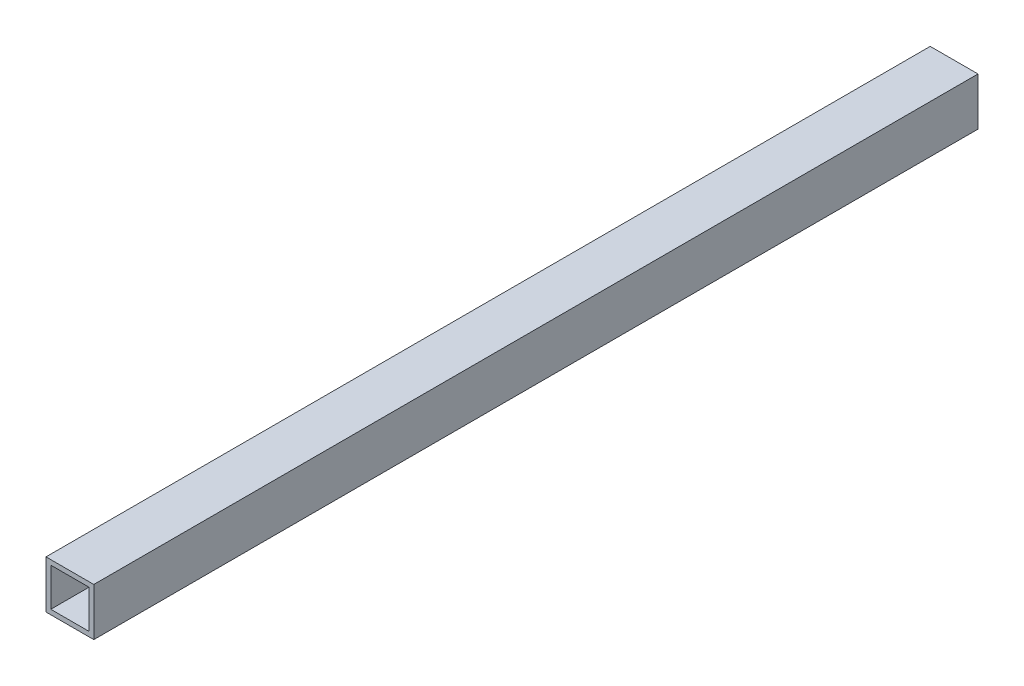
ISO-10303-21;
HEADER;
FILE_DESCRIPTION(('STEP AP214'),'2;1');
FILE_NAME('part.step','',(''),(''),'','','');
FILE_SCHEMA(('AUTOMOTIVE_DESIGN { 1 0 10303 214 1 1 1 1 }'));
ENDSEC;
DATA;
#1=APPLICATION_CONTEXT('core data for automotive mechanical design processes');
#2=APPLICATION_PROTOCOL_DEFINITION('international standard','automotive_design',2000,#1);
#3=PRODUCT_CONTEXT('',#1,'mechanical');
#4=PRODUCT('Part','Part','',(#3));
#5=PRODUCT_RELATED_PRODUCT_CATEGORY('part','',(#4));
#6=PRODUCT_DEFINITION_FORMATION('','',#4);
#7=PRODUCT_DEFINITION_CONTEXT('part definition',#1,'design');
#8=PRODUCT_DEFINITION('design','',#6,#7);
#9=PRODUCT_DEFINITION_SHAPE('','',#8);
#10=(LENGTH_UNIT() NAMED_UNIT(*) SI_UNIT(.MILLI.,.METRE.));
#11=(NAMED_UNIT(*) PLANE_ANGLE_UNIT() SI_UNIT($,.RADIAN.));
#12=(NAMED_UNIT(*) SI_UNIT($,.STERADIAN.) SOLID_ANGLE_UNIT());
#13=UNCERTAINTY_MEASURE_WITH_UNIT(LENGTH_MEASURE(1.E-05),#10,'distance_accuracy_value','');
#14=(GEOMETRIC_REPRESENTATION_CONTEXT(3) GLOBAL_UNCERTAINTY_ASSIGNED_CONTEXT((#13)) GLOBAL_UNIT_ASSIGNED_CONTEXT((#10,
#11,#12)) REPRESENTATION_CONTEXT('',''));
#15=CARTESIAN_POINT('',(0.,0.,0.));
#16=DIRECTION('',(0.,0.,1.));
#17=DIRECTION('',(1.,0.,0.));
#18=AXIS2_PLACEMENT_3D('',#15,#16,#17);
#19=CARTESIAN_POINT('',(0.,0.,234.95));
#20=DIRECTION('',(0.,0.,-1.));
#21=DIRECTION('',(-1.,0.,0.));
#22=AXIS2_PLACEMENT_3D('',#19,#20,#21);
#23=PLANE('',#22);
#24=DIRECTION('',(0.,1.,0.));
#25=VECTOR('',#24,1.);
#26=CARTESIAN_POINT('',(12.7,-12.7,234.95));
#27=LINE('',#26,#25);
#28=CARTESIAN_POINT('',(12.7,-12.7,234.95));
#29=VERTEX_POINT('',#28);
#30=CARTESIAN_POINT('',(12.7,12.7,234.95));
#31=VERTEX_POINT('',#30);
#32=EDGE_CURVE('E137',#29,#31,#27,.T.);
#33=ORIENTED_EDGE('',*,*,#32,.T.);
#34=DIRECTION('',(-1.,0.,0.));
#35=VECTOR('',#34,1.);
#36=CARTESIAN_POINT('',(-12.7,12.7,234.95));
#37=LINE('',#36,#35);
#38=CARTESIAN_POINT('',(-12.7,12.7,234.95));
#39=VERTEX_POINT('',#38);
#40=EDGE_CURVE('E140',#31,#39,#37,.T.);
#41=ORIENTED_EDGE('',*,*,#40,.T.);
#42=DIRECTION('',(0.,-1.,0.));
#43=VECTOR('',#42,1.);
#44=CARTESIAN_POINT('',(-12.7,-12.7,234.95));
#45=LINE('',#44,#43);
#46=CARTESIAN_POINT('',(-12.7,-12.7,234.95));
#47=VERTEX_POINT('',#46);
#48=EDGE_CURVE('E143',#39,#47,#45,.T.);
#49=ORIENTED_EDGE('',*,*,#48,.T.);
#50=DIRECTION('',(1.,0.,0.));
#51=VECTOR('',#50,1.);
#52=CARTESIAN_POINT('',(-12.7,-12.7,234.95));
#53=LINE('',#52,#51);
#54=EDGE_CURVE('E145',#47,#29,#53,.T.);
#55=ORIENTED_EDGE('',*,*,#54,.T.);
#56=EDGE_LOOP('',(#33,#41,#49,#55));
#57=FACE_BOUND('',#56,.T.);
#58=DIRECTION('',(0.,-1.,0.));
#59=VECTOR('',#58,1.);
#60=CARTESIAN_POINT('',(-10.16,-10.16,234.95));
#61=LINE('',#60,#59);
#62=CARTESIAN_POINT('',(-10.16,10.16,234.95));
#63=VERTEX_POINT('',#62);
#64=CARTESIAN_POINT('',(-10.16,-10.16,234.95));
#65=VERTEX_POINT('',#64);
#66=EDGE_CURVE('E101',#63,#65,#61,.T.);
#67=ORIENTED_EDGE('',*,*,#66,.F.);
#68=DIRECTION('',(-1.,0.,0.));
#69=VECTOR('',#68,1.);
#70=CARTESIAN_POINT('',(-10.16,10.16,234.95));
#71=LINE('',#70,#69);
#72=CARTESIAN_POINT('',(10.16,10.16,234.95));
#73=VERTEX_POINT('',#72);
#74=EDGE_CURVE('E123',#73,#63,#71,.T.);
#75=ORIENTED_EDGE('',*,*,#74,.F.);
#76=DIRECTION('',(0.,1.,0.));
#77=VECTOR('',#76,1.);
#78=CARTESIAN_POINT('',(10.16,-10.16,234.95));
#79=LINE('',#78,#77);
#80=CARTESIAN_POINT('',(10.16,-10.16,234.95));
#81=VERTEX_POINT('',#80);
#82=EDGE_CURVE('E121',#81,#73,#79,.T.);
#83=ORIENTED_EDGE('',*,*,#82,.F.);
#84=DIRECTION('',(1.,0.,0.));
#85=VECTOR('',#84,1.);
#86=CARTESIAN_POINT('',(-10.16,-10.16,234.95));
#87=LINE('',#86,#85);
#88=EDGE_CURVE('E109',#65,#81,#87,.T.);
#89=ORIENTED_EDGE('',*,*,#88,.F.);
#90=EDGE_LOOP('',(#67,#75,#83,#89));
#91=FACE_BOUND('',#90,.T.);
#92=ADVANCED_FACE('F36',(#57,#91),#23,.F.);
#93=CARTESIAN_POINT('',(0.,0.,-234.95));
#94=DIRECTION('',(0.,0.,-1.));
#95=DIRECTION('',(-1.,0.,0.));
#96=AXIS2_PLACEMENT_3D('',#93,#94,#95);
#97=PLANE('',#96);
#98=DIRECTION('',(0.,1.,0.));
#99=VECTOR('',#98,1.);
#100=CARTESIAN_POINT('',(12.7,-12.7,-234.95));
#101=LINE('',#100,#99);
#102=CARTESIAN_POINT('',(12.7,-12.7,-234.95));
#103=VERTEX_POINT('',#102);
#104=CARTESIAN_POINT('',(12.7,12.7,-234.95));
#105=VERTEX_POINT('',#104);
#106=EDGE_CURVE('E117',#103,#105,#101,.T.);
#107=ORIENTED_EDGE('',*,*,#106,.F.);
#108=DIRECTION('',(1.,0.,0.));
#109=VECTOR('',#108,1.);
#110=CARTESIAN_POINT('',(-12.7,-12.7,-234.95));
#111=LINE('',#110,#109);
#112=CARTESIAN_POINT('',(-12.7,-12.7,-234.95));
#113=VERTEX_POINT('',#112);
#114=EDGE_CURVE('E141',#113,#103,#111,.T.);
#115=ORIENTED_EDGE('',*,*,#114,.F.);
#116=DIRECTION('',(0.,-1.,0.));
#117=VECTOR('',#116,1.);
#118=CARTESIAN_POINT('',(-12.7,-12.7,-234.95));
#119=LINE('',#118,#117);
#120=CARTESIAN_POINT('',(-12.7,12.7,-234.95));
#121=VERTEX_POINT('',#120);
#122=EDGE_CURVE('E152',#121,#113,#119,.T.);
#123=ORIENTED_EDGE('',*,*,#122,.F.);
#124=DIRECTION('',(-1.,0.,0.));
#125=VECTOR('',#124,1.);
#126=CARTESIAN_POINT('',(-12.7,12.7,-234.95));
#127=LINE('',#126,#125);
#128=EDGE_CURVE('E150',#105,#121,#127,.T.);
#129=ORIENTED_EDGE('',*,*,#128,.F.);
#130=EDGE_LOOP('',(#107,#115,#123,#129));
#131=FACE_BOUND('',#130,.T.);
#132=DIRECTION('',(-1.,0.,0.));
#133=VECTOR('',#132,1.);
#134=CARTESIAN_POINT('',(-10.16,10.16,-234.95));
#135=LINE('',#134,#133);
#136=CARTESIAN_POINT('',(10.16,10.16,-234.95));
#137=VERTEX_POINT('',#136);
#138=CARTESIAN_POINT('',(-10.16,10.16,-234.95));
#139=VERTEX_POINT('',#138);
#140=EDGE_CURVE('E110',#137,#139,#135,.T.);
#141=ORIENTED_EDGE('',*,*,#140,.T.);
#142=DIRECTION('',(0.,-1.,0.));
#143=VECTOR('',#142,1.);
#144=CARTESIAN_POINT('',(-10.16,-10.16,-234.95));
#145=LINE('',#144,#143);
#146=CARTESIAN_POINT('',(-10.16,-10.16,-234.95));
#147=VERTEX_POINT('',#146);
#148=EDGE_CURVE('E59',#139,#147,#145,.T.);
#149=ORIENTED_EDGE('',*,*,#148,.T.);
#150=DIRECTION('',(1.,0.,0.));
#151=VECTOR('',#150,1.);
#152=CARTESIAN_POINT('',(-10.16,-10.16,-234.95));
#153=LINE('',#152,#151);
#154=CARTESIAN_POINT('',(10.16,-10.16,-234.95));
#155=VERTEX_POINT('',#154);
#156=EDGE_CURVE('E116',#147,#155,#153,.T.);
#157=ORIENTED_EDGE('',*,*,#156,.T.);
#158=DIRECTION('',(0.,1.,0.));
#159=VECTOR('',#158,1.);
#160=CARTESIAN_POINT('',(10.16,-10.16,-234.95));
#161=LINE('',#160,#159);
#162=EDGE_CURVE('E129',#155,#137,#161,.T.);
#163=ORIENTED_EDGE('',*,*,#162,.T.);
#164=EDGE_LOOP('',(#141,#149,#157,#163));
#165=FACE_BOUND('',#164,.T.);
#166=ADVANCED_FACE('F170',(#131,#165),#97,.T.);
#167=CARTESIAN_POINT('',(12.7,-12.7,234.95));
#168=DIRECTION('',(-1.,0.,0.));
#169=DIRECTION('',(0.,-1.,0.));
#170=AXIS2_PLACEMENT_3D('',#167,#168,#169);
#171=PLANE('',#170);
#172=ORIENTED_EDGE('',*,*,#106,.T.);
#173=DIRECTION('',(0.,0.,-1.));
#174=VECTOR('',#173,1.);
#175=CARTESIAN_POINT('',(12.7,12.7,234.95));
#176=LINE('',#175,#174);
#177=EDGE_CURVE('E11',#31,#105,#176,.T.);
#178=ORIENTED_EDGE('',*,*,#177,.F.);
#179=ORIENTED_EDGE('',*,*,#32,.F.);
#180=DIRECTION('',(0.,0.,-1.));
#181=VECTOR('',#180,1.);
#182=CARTESIAN_POINT('',(12.7,-12.7,234.95));
#183=LINE('',#182,#181);
#184=EDGE_CURVE('E147',#29,#103,#183,.T.);
#185=ORIENTED_EDGE('',*,*,#184,.T.);
#186=EDGE_LOOP('',(#172,#178,#179,#185));
#187=FACE_BOUND('',#186,.T.);
#188=ADVANCED_FACE('F38',(#187),#171,.F.);
#189=CARTESIAN_POINT('',(-12.7,12.7,234.95));
#190=DIRECTION('',(0.,-1.,0.));
#191=DIRECTION('',(0.,0.,-1.));
#192=AXIS2_PLACEMENT_3D('',#189,#190,#191);
#193=PLANE('',#192);
#194=ORIENTED_EDGE('',*,*,#128,.T.);
#195=DIRECTION('',(0.,0.,-1.));
#196=VECTOR('',#195,1.);
#197=CARTESIAN_POINT('',(-12.7,12.7,234.95));
#198=LINE('',#197,#196);
#199=EDGE_CURVE('E44',#39,#121,#198,.T.);
#200=ORIENTED_EDGE('',*,*,#199,.F.);
#201=ORIENTED_EDGE('',*,*,#40,.F.);
#202=ORIENTED_EDGE('',*,*,#177,.T.);
#203=EDGE_LOOP('',(#194,#200,#201,#202));
#204=FACE_BOUND('',#203,.T.);
#205=ADVANCED_FACE('F180',(#204),#193,.F.);
#206=CARTESIAN_POINT('',(-12.7,-12.7,234.95));
#207=DIRECTION('',(1.,0.,0.));
#208=DIRECTION('',(0.,1.,0.));
#209=AXIS2_PLACEMENT_3D('',#206,#207,#208);
#210=PLANE('',#209);
#211=ORIENTED_EDGE('',*,*,#122,.T.);
#212=DIRECTION('',(0.,0.,-1.));
#213=VECTOR('',#212,1.);
#214=CARTESIAN_POINT('',(-12.7,-12.7,234.95));
#215=LINE('',#214,#213);
#216=EDGE_CURVE('E157',#47,#113,#215,.T.);
#217=ORIENTED_EDGE('',*,*,#216,.F.);
#218=ORIENTED_EDGE('',*,*,#48,.F.);
#219=ORIENTED_EDGE('',*,*,#199,.T.);
#220=EDGE_LOOP('',(#211,#217,#218,#219));
#221=FACE_BOUND('',#220,.T.);
#222=ADVANCED_FACE('F164',(#221),#210,.F.);
#223=CARTESIAN_POINT('',(-12.7,-12.7,234.95));
#224=DIRECTION('',(0.,1.,0.));
#225=DIRECTION('',(-1.,0.,0.));
#226=AXIS2_PLACEMENT_3D('',#223,#224,#225);
#227=PLANE('',#226);
#228=ORIENTED_EDGE('',*,*,#114,.T.);
#229=ORIENTED_EDGE('',*,*,#184,.F.);
#230=ORIENTED_EDGE('',*,*,#54,.F.);
#231=ORIENTED_EDGE('',*,*,#216,.T.);
#232=EDGE_LOOP('',(#228,#229,#230,#231));
#233=FACE_BOUND('',#232,.T.);
#234=ADVANCED_FACE('F174',(#233),#227,.F.);
#235=CARTESIAN_POINT('',(-10.16,-10.16,234.95));
#236=DIRECTION('',(1.,0.,0.));
#237=DIRECTION('',(0.,0.,-1.));
#238=AXIS2_PLACEMENT_3D('',#235,#236,#237);
#239=PLANE('',#238);
#240=ORIENTED_EDGE('',*,*,#148,.F.);
#241=DIRECTION('',(0.,0.,-1.));
#242=VECTOR('',#241,1.);
#243=CARTESIAN_POINT('',(-10.16,10.16,234.95));
#244=LINE('',#243,#242);
#245=EDGE_CURVE('E105',#63,#139,#244,.T.);
#246=ORIENTED_EDGE('',*,*,#245,.F.);
#247=ORIENTED_EDGE('',*,*,#66,.T.);
#248=DIRECTION('',(0.,0.,-1.));
#249=VECTOR('',#248,1.);
#250=CARTESIAN_POINT('',(-10.16,-10.16,234.95));
#251=LINE('',#250,#249);
#252=EDGE_CURVE('E104',#65,#147,#251,.T.);
#253=ORIENTED_EDGE('',*,*,#252,.T.);
#254=EDGE_LOOP('',(#240,#246,#247,#253));
#255=FACE_BOUND('',#254,.T.);
#256=ADVANCED_FACE('F103',(#255),#239,.T.);
#257=CARTESIAN_POINT('',(-10.16,-10.16,234.95));
#258=DIRECTION('',(0.,1.,0.));
#259=DIRECTION('',(0.,0.,1.));
#260=AXIS2_PLACEMENT_3D('',#257,#258,#259);
#261=PLANE('',#260);
#262=ORIENTED_EDGE('',*,*,#156,.F.);
#263=ORIENTED_EDGE('',*,*,#252,.F.);
#264=ORIENTED_EDGE('',*,*,#88,.T.);
#265=DIRECTION('',(0.,0.,-1.));
#266=VECTOR('',#265,1.);
#267=CARTESIAN_POINT('',(10.16,-10.16,234.95));
#268=LINE('',#267,#266);
#269=EDGE_CURVE('E118',#81,#155,#268,.T.);
#270=ORIENTED_EDGE('',*,*,#269,.T.);
#271=EDGE_LOOP('',(#262,#263,#264,#270));
#272=FACE_BOUND('',#271,.T.);
#273=ADVANCED_FACE('F113',(#272),#261,.T.);
#274=CARTESIAN_POINT('',(10.16,-10.16,234.95));
#275=DIRECTION('',(-1.,0.,0.));
#276=DIRECTION('',(0.,0.,1.));
#277=AXIS2_PLACEMENT_3D('',#274,#275,#276);
#278=PLANE('',#277);
#279=ORIENTED_EDGE('',*,*,#162,.F.);
#280=ORIENTED_EDGE('',*,*,#269,.F.);
#281=ORIENTED_EDGE('',*,*,#82,.T.);
#282=DIRECTION('',(0.,0.,-1.));
#283=VECTOR('',#282,1.);
#284=CARTESIAN_POINT('',(10.16,10.16,234.95));
#285=LINE('',#284,#283);
#286=EDGE_CURVE('E51',#73,#137,#285,.T.);
#287=ORIENTED_EDGE('',*,*,#286,.T.);
#288=EDGE_LOOP('',(#279,#280,#281,#287));
#289=FACE_BOUND('',#288,.T.);
#290=ADVANCED_FACE('F203',(#289),#278,.T.);
#291=CARTESIAN_POINT('',(-10.16,10.16,234.95));
#292=DIRECTION('',(0.,-1.,0.));
#293=DIRECTION('',(0.,0.,-1.));
#294=AXIS2_PLACEMENT_3D('',#291,#292,#293);
#295=PLANE('',#294);
#296=ORIENTED_EDGE('',*,*,#140,.F.);
#297=ORIENTED_EDGE('',*,*,#286,.F.);
#298=ORIENTED_EDGE('',*,*,#74,.T.);
#299=ORIENTED_EDGE('',*,*,#245,.T.);
#300=EDGE_LOOP('',(#296,#297,#298,#299));
#301=FACE_BOUND('',#300,.T.);
#302=ADVANCED_FACE('F207',(#301),#295,.T.);
#303=CLOSED_SHELL('',(#92,#166,#188,#205,#222,#234,#256,#273,#290,#302));
#304=MANIFOLD_SOLID_BREP('B2',#303);
#305=ADVANCED_BREP_SHAPE_REPRESENTATION('',(#18,#304),#14);
#306=SHAPE_DEFINITION_REPRESENTATION(#9,#305);
ENDSEC;
END-ISO-10303-21;
